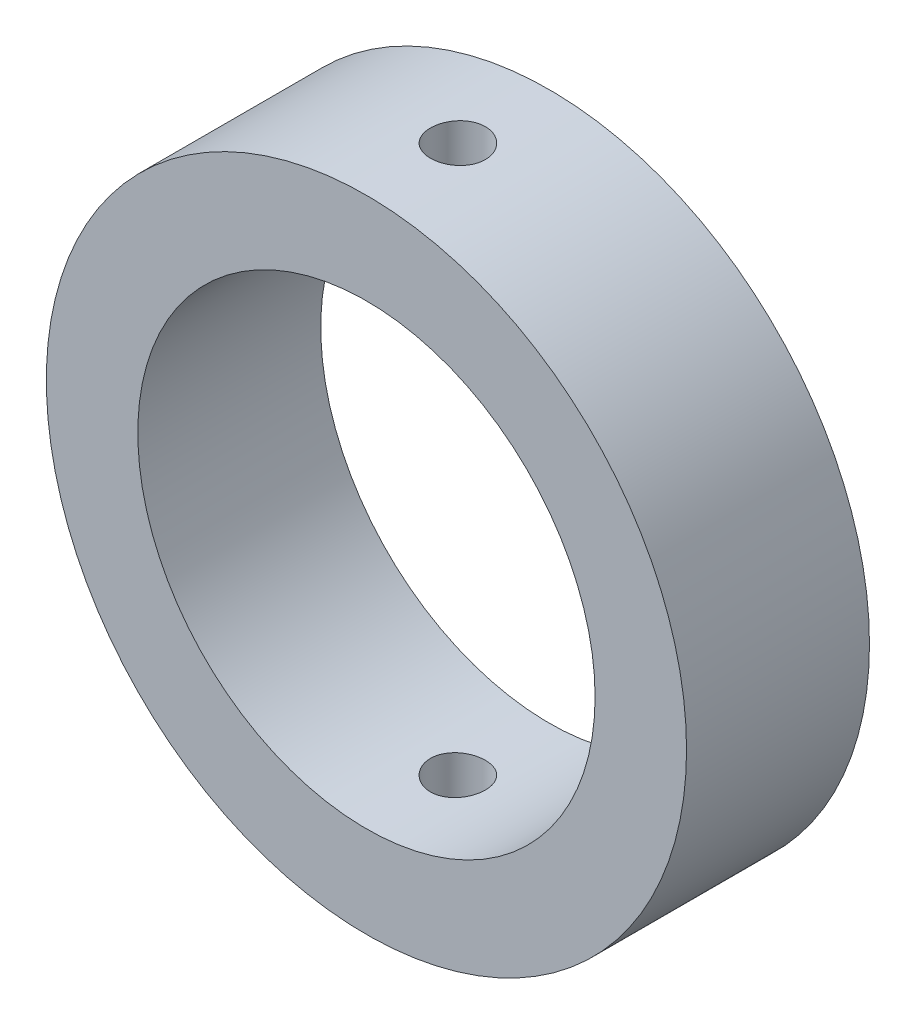
ISO-10303-21;
HEADER;
FILE_DESCRIPTION(('STEP AP214'),'2;1');
FILE_NAME('part.step','',(''),(''),'','','');
FILE_SCHEMA(('AUTOMOTIVE_DESIGN { 1 0 10303 214 1 1 1 1 }'));
ENDSEC;
DATA;
#1=APPLICATION_CONTEXT('core data for automotive mechanical design processes');
#2=APPLICATION_PROTOCOL_DEFINITION('international standard','automotive_design',2000,#1);
#3=PRODUCT_CONTEXT('',#1,'mechanical');
#4=PRODUCT('Part','Part','',(#3));
#5=PRODUCT_RELATED_PRODUCT_CATEGORY('part','',(#4));
#6=PRODUCT_DEFINITION_FORMATION('','',#4);
#7=PRODUCT_DEFINITION_CONTEXT('part definition',#1,'design');
#8=PRODUCT_DEFINITION('design','',#6,#7);
#9=PRODUCT_DEFINITION_SHAPE('','',#8);
#10=(LENGTH_UNIT() NAMED_UNIT(*) SI_UNIT(.MILLI.,.METRE.));
#11=(NAMED_UNIT(*) PLANE_ANGLE_UNIT() SI_UNIT($,.RADIAN.));
#12=(NAMED_UNIT(*) SI_UNIT($,.STERADIAN.) SOLID_ANGLE_UNIT());
#13=UNCERTAINTY_MEASURE_WITH_UNIT(LENGTH_MEASURE(1.E-05),#10,'distance_accuracy_value','');
#14=(GEOMETRIC_REPRESENTATION_CONTEXT(3) GLOBAL_UNCERTAINTY_ASSIGNED_CONTEXT((#13)) GLOBAL_UNIT_ASSIGNED_CONTEXT((#10,
#11,#12)) REPRESENTATION_CONTEXT('',''));
#15=CARTESIAN_POINT('',(0.,0.,0.));
#16=DIRECTION('',(0.,0.,1.));
#17=DIRECTION('',(1.,0.,0.));
#18=AXIS2_PLACEMENT_3D('',#15,#16,#17);
#19=CARTESIAN_POINT('',(0.,0.,20.));
#20=DIRECTION('',(0.,0.,1.));
#21=DIRECTION('',(1.,0.,0.));
#22=AXIS2_PLACEMENT_3D('',#19,#20,#21);
#23=PLANE('',#22);
#24=CARTESIAN_POINT('',(0.,0.,20.));
#25=DIRECTION('',(0.,0.,1.));
#26=DIRECTION('',(1.,0.,0.));
#27=AXIS2_PLACEMENT_3D('',#24,#25,#26);
#28=CIRCLE('',#27,35.);
#29=CARTESIAN_POINT('',(35.,0.,20.));
#30=VERTEX_POINT('',#29);
#31=EDGE_CURVE('E10',#30,#30,#28,.T.);
#32=ORIENTED_EDGE('',*,*,#31,.T.);
#33=EDGE_LOOP('',(#32));
#34=FACE_BOUND('',#33,.T.);
#35=CARTESIAN_POINT('',(0.,0.,20.));
#36=DIRECTION('',(0.,0.,1.));
#37=DIRECTION('',(1.,0.,0.));
#38=AXIS2_PLACEMENT_3D('',#35,#36,#37);
#39=CIRCLE('',#38,25.);
#40=CARTESIAN_POINT('',(25.,0.,20.));
#41=VERTEX_POINT('',#40);
#42=EDGE_CURVE('E58',#41,#41,#39,.T.);
#43=ORIENTED_EDGE('',*,*,#42,.F.);
#44=EDGE_LOOP('',(#43));
#45=FACE_BOUND('',#44,.T.);
#46=ADVANCED_FACE('F37',(#34,#45),#23,.T.);
#47=CARTESIAN_POINT('',(0.,0.,0.));
#48=DIRECTION('',(0.,0.,1.));
#49=DIRECTION('',(1.,0.,0.));
#50=AXIS2_PLACEMENT_3D('',#47,#48,#49);
#51=PLANE('',#50);
#52=CARTESIAN_POINT('',(0.,0.,0.));
#53=DIRECTION('',(0.,0.,1.));
#54=DIRECTION('',(1.,0.,0.));
#55=AXIS2_PLACEMENT_3D('',#52,#53,#54);
#56=CIRCLE('',#55,35.);
#57=CARTESIAN_POINT('',(35.,0.,0.));
#58=VERTEX_POINT('',#57);
#59=EDGE_CURVE('E52',#58,#58,#56,.T.);
#60=ORIENTED_EDGE('',*,*,#59,.F.);
#61=EDGE_LOOP('',(#60));
#62=FACE_BOUND('',#61,.T.);
#63=CARTESIAN_POINT('',(0.,0.,0.));
#64=DIRECTION('',(0.,0.,1.));
#65=DIRECTION('',(1.,0.,0.));
#66=AXIS2_PLACEMENT_3D('',#63,#64,#65);
#67=CIRCLE('',#66,25.);
#68=CARTESIAN_POINT('',(25.,0.,0.));
#69=VERTEX_POINT('',#68);
#70=EDGE_CURVE('E61',#69,#69,#67,.T.);
#71=ORIENTED_EDGE('',*,*,#70,.T.);
#72=EDGE_LOOP('',(#71));
#73=FACE_BOUND('',#72,.T.);
#74=ADVANCED_FACE('F102',(#62,#73),#51,.F.);
#75=CARTESIAN_POINT('',(0.,0.,20.));
#76=DIRECTION('',(0.,0.,-1.));
#77=DIRECTION('',(-1.,0.,0.));
#78=AXIS2_PLACEMENT_3D('',#75,#76,#77);
#79=CYLINDRICAL_SURFACE('',#78,35.);
#80=CARTESIAN_POINT('',(0.,-35.,13.));
#81=CARTESIAN_POINT('',(0.168180177421425,-34.9999983189466,12.9999926621086));
#82=CARTESIAN_POINT('',(0.336474410694065,-34.9987748870089,12.9858101377132));
#83=CARTESIAN_POINT('',(0.668405276387218,-34.9940120055983,12.9294427662291));
#84=CARTESIAN_POINT('',(0.832036433522409,-34.9904699418268,12.8872263096079));
#85=CARTESIAN_POINT('',(1.14978580604665,-34.9814700099417,12.7760219308489));
#86=CARTESIAN_POINT('',(1.30390939390644,-34.9760132356579,12.7070492915307));
#87=CARTESIAN_POINT('',(1.5983553572425,-34.9637955952331,12.5443180840418));
#88=CARTESIAN_POINT('',(1.7386806487592,-34.9570350055299,12.4505647683675));
#89=CARTESIAN_POINT('',(2.00196024172095,-34.9429478698077,12.2406617110507));
#90=CARTESIAN_POINT('',(2.12487233650439,-34.9356200130701,12.1244591132005));
#91=CARTESIAN_POINT('',(2.34947428548936,-34.9212352148941,11.8730679106441));
#92=CARTESIAN_POINT('',(2.45116320107853,-34.9141782854488,11.7378784666713));
#93=CARTESIAN_POINT('',(2.63057608789142,-34.9011203668809,11.4520942390574));
#94=CARTESIAN_POINT('',(2.70826279885841,-34.895121025662,11.3014759820008));
#95=CARTESIAN_POINT('',(2.83722803822898,-34.8848727505605,10.9892731041776));
#96=CARTESIAN_POINT('',(2.88850705745045,-34.8806237841455,10.8276886872931));
#97=CARTESIAN_POINT('',(2.96307845769353,-34.8743684880487,10.4985643557107));
#98=CARTESIAN_POINT('',(2.98643979537529,-34.8723566335604,10.3310401716124));
#99=CARTESIAN_POINT('',(3.00472573441206,-34.8707859372111,9.99443731566983));
#100=CARTESIAN_POINT('',(2.99965089755265,-34.8712270468893,9.82535867460139));
#101=CARTESIAN_POINT('',(2.96126551313284,-34.874507414771,9.49091935009246));
#102=CARTESIAN_POINT('',(2.92802995365881,-34.8773403039272,9.32554998866099));
#103=CARTESIAN_POINT('',(2.83438308452453,-34.8850750500347,9.00274549875546));
#104=CARTESIAN_POINT('',(2.77397149596722,-34.8899769282191,8.84531045172664));
#105=CARTESIAN_POINT('',(2.62760362876988,-34.9013046627491,8.5426048976093));
#106=CARTESIAN_POINT('',(2.54161375570937,-34.9077325210554,8.39735071245931));
#107=CARTESIAN_POINT('',(2.34655446417304,-34.9213861292491,8.12330862382476));
#108=CARTESIAN_POINT('',(2.23748455081154,-34.9286118962437,7.99452107351525));
#109=CARTESIAN_POINT('',(1.99894091774494,-34.9430754969892,7.75663207823613));
#110=CARTESIAN_POINT('',(1.86940237855328,-34.9503132942366,7.64759561833133));
#111=CARTESIAN_POINT('',(1.59382461581758,-34.9639632077666,7.45280656292255));
#112=CARTESIAN_POINT('',(1.44778538038973,-34.9703753234546,7.36705398418779));
#113=CARTESIAN_POINT('',(1.14330913680171,-34.9816527329005,7.2212707481009));
#114=CARTESIAN_POINT('',(0.984870717201058,-34.9865178502383,7.16124302414623));
#115=CARTESIAN_POINT('',(0.66011322112835,-34.9941511080319,7.06865924334512));
#116=CARTESIAN_POINT('',(0.493794317781497,-34.9969192945321,7.03610258328611));
#117=CARTESIAN_POINT('',(0.15856025083397,-35.0000408811527,6.99946669791016));
#118=CARTESIAN_POINT('',(-0.0103450366761302,-35.0004018916599,6.99529772286168));
#119=CARTESIAN_POINT('',(-0.346452104482659,-34.9986887867208,7.01532035576532));
#120=CARTESIAN_POINT('',(-0.513653901587615,-34.9966146953254,7.03951168360929));
#121=CARTESIAN_POINT('',(-0.841351421558966,-34.9902695086844,7.11549382233641));
#122=CARTESIAN_POINT('',(-1.00185687270474,-34.9860017297263,7.16724297716301));
#123=CARTESIAN_POINT('',(-1.31190702245475,-34.9757485102754,7.29682922006561));
#124=CARTESIAN_POINT('',(-1.46145153801856,-34.9697630411066,7.37466674367936));
#125=CARTESIAN_POINT('',(-1.7457428816744,-34.9567262474856,7.55444535294469));
#126=CARTESIAN_POINT('',(-1.88045202960912,-34.9496723123826,7.65644583152676));
#127=CARTESIAN_POINT('',(-2.13086824169311,-34.9352996751561,7.88156921992449));
#128=CARTESIAN_POINT('',(-2.24657495644839,-34.9279809681673,8.00469251803617));
#129=CARTESIAN_POINT('',(-2.45601016602155,-34.9138810732733,8.26895626973909));
#130=CARTESIAN_POINT('',(-2.54968004901865,-34.9071013498897,8.41014326356234));
#131=CARTESIAN_POINT('',(-2.71198063229128,-34.8948680127784,8.70629524502194));
#132=CARTESIAN_POINT('',(-2.78061159495576,-34.8894143851545,8.8612600882557));
#133=CARTESIAN_POINT('',(-2.8907865424564,-34.8804590783594,9.180362211124));
#134=CARTESIAN_POINT('',(-2.93236627395852,-34.8769548240937,9.34448707344406));
#135=CARTESIAN_POINT('',(-2.98737479633476,-34.872286503041,9.67742005737787));
#136=CARTESIAN_POINT('',(-3.0008041627162,-34.871122388412,9.84622808317732));
#137=CARTESIAN_POINT('',(-2.99912392353084,-34.8712668950776,10.1831530647903));
#138=CARTESIAN_POINT('',(-2.98410640669543,-34.8725675374248,10.3512704909289));
#139=CARTESIAN_POINT('',(-2.92615085557176,-34.8774780477604,10.6825859274482));
#140=CARTESIAN_POINT('',(-2.88321277999482,-34.8810879191635,10.8457839305537));
#141=CARTESIAN_POINT('',(-2.7706585792072,-34.8902080316544,11.1626330215739));
#142=CARTESIAN_POINT('',(-2.70104425727074,-34.8957181442861,11.3162847539864));
#143=CARTESIAN_POINT('',(-2.53712384137618,-34.9080181097009,11.6097355757974));
#144=CARTESIAN_POINT('',(-2.4428181018962,-34.9148079441114,11.7495348640265));
#145=CARTESIAN_POINT('',(-2.23184571903132,-34.9289284828144,12.0117838459397));
#146=CARTESIAN_POINT('',(-2.11511080731054,-34.9362607952504,12.1341785330169));
#147=CARTESIAN_POINT('',(-1.86271960746937,-34.9506254222313,12.357688026767));
#148=CARTESIAN_POINT('',(-1.72705875414518,-34.9576576638589,12.4587976843829));
#149=CARTESIAN_POINT('',(-1.44039065385252,-34.9706432183248,12.6370108284413));
#150=CARTESIAN_POINT('',(-1.28935405311577,-34.9765944046818,12.7140672103455));
#151=CARTESIAN_POINT('',(-0.976537475486436,-34.9867226680456,12.8416267776672));
#152=CARTESIAN_POINT('',(-0.814770058056751,-34.9909017781752,12.8921604088507));
#153=CARTESIAN_POINT('',(-0.543377751492647,-34.9959451685553,12.9524054943071));
#154=CARTESIAN_POINT('',(-0.4354969109927,-34.9974587860022,12.9702296244532));
#155=CARTESIAN_POINT('',(-0.218426750644092,-34.999486746251,12.9940292435666));
#156=CARTESIAN_POINT('',(-0.109237434508938,-35.0000010918883,13.0000047661528));
#157=CARTESIAN_POINT('',(0.,-35.,13.));
#158=B_SPLINE_CURVE_WITH_KNOTS('',3,(#80,#81,#82,#83,#84,#85,#86,#87,#88,#89,#90,#91,#92,#93,
#94,#95,#96,#97,#98,#99,#100,#101,#102,#103,#104,#105,#106,#107,#108,#109,#110,#111,#112,#113,
#114,#115,#116,#117,#118,#119,#120,#121,#122,#123,#124,#125,#126,#127,#128,#129,#130,#131,#132,
#133,#134,#135,#136,#137,#138,#139,#140,#141,#142,#143,#144,#145,#146,#147,#148,#149,#150,#151,
#152,#153,#154,#155,#156,#157),.UNSPECIFIED.,.T.,.F.,(4,2,2,2,2,2,2,2,2,2,2,2,2,2,2,2,2,2,2,2,2,
2,2,2,2,2,2,2,2,2,2,2,2,2,2,2,2,2,4),(0.,0.504141688620747,1.00885278730409,1.51327602436422,
2.01759242981481,2.5231110330061,3.0286519884333,3.53497383147415,4.04128626359052,
4.54634550220951,5.05139476290399,5.55510335902216,6.05881712462464,6.56319540924795,
7.06758450992202,7.57360414720597,8.07962414892789,8.58570183661505,9.09176841150507,
9.59623427417642,10.1006951543972,10.6043956535469,11.1081045622491,11.6130646830275,
12.1180340873686,12.6243317573245,13.1306241215114,13.636246082805,14.1418577070399,
14.6458353534655,15.1498137451707,15.6537580747011,16.1576951698375,16.6631911333163,
17.1688092410494,17.6754113983993,18.1814307424438,18.5088849156758,18.8363381597995),.UNSPECIFIED.);
#159=CARTESIAN_POINT('',(0.,-35.,13.));
#160=VERTEX_POINT('',#159);
#161=EDGE_CURVE('E88',#160,#160,#158,.T.);
#162=ORIENTED_EDGE('',*,*,#161,.T.);
#163=EDGE_LOOP('',(#162));
#164=FACE_BOUND('',#163,.T.);
#165=CARTESIAN_POINT('',(0.,35.,13.));
#166=CARTESIAN_POINT('',(-0.168180177421425,34.9999983189466,12.9999926621086));
#167=CARTESIAN_POINT('',(-0.336474410694065,34.9987748870089,12.9858101377132));
#168=CARTESIAN_POINT('',(-0.668405276387218,34.9940120055983,12.9294427662291));
#169=CARTESIAN_POINT('',(-0.832036433522409,34.9904699418268,12.8872263096079));
#170=CARTESIAN_POINT('',(-1.14978580604665,34.9814700099417,12.7760219308489));
#171=CARTESIAN_POINT('',(-1.30390939390644,34.9760132356579,12.7070492915307));
#172=CARTESIAN_POINT('',(-1.5983553572425,34.9637955952331,12.5443180840418));
#173=CARTESIAN_POINT('',(-1.7386806487592,34.9570350055299,12.4505647683675));
#174=CARTESIAN_POINT('',(-2.00196024172095,34.9429478698077,12.2406617110507));
#175=CARTESIAN_POINT('',(-2.12487233650439,34.9356200130701,12.1244591132005));
#176=CARTESIAN_POINT('',(-2.34947428548936,34.9212352148941,11.8730679106441));
#177=CARTESIAN_POINT('',(-2.45116320107853,34.9141782854488,11.7378784666713));
#178=CARTESIAN_POINT('',(-2.63057608789142,34.9011203668809,11.4520942390574));
#179=CARTESIAN_POINT('',(-2.70826279885841,34.895121025662,11.3014759820008));
#180=CARTESIAN_POINT('',(-2.83722803822898,34.8848727505605,10.9892731041776));
#181=CARTESIAN_POINT('',(-2.88850705745045,34.8806237841455,10.8276886872931));
#182=CARTESIAN_POINT('',(-2.96307845769353,34.8743684880487,10.4985643557107));
#183=CARTESIAN_POINT('',(-2.98643979537529,34.8723566335604,10.3310401716124));
#184=CARTESIAN_POINT('',(-3.00472573441206,34.8707859372111,9.99443731566983));
#185=CARTESIAN_POINT('',(-2.99965089755265,34.8712270468893,9.82535867460139));
#186=CARTESIAN_POINT('',(-2.96126551313284,34.874507414771,9.49091935009246));
#187=CARTESIAN_POINT('',(-2.92802995365881,34.8773403039272,9.32554998866099));
#188=CARTESIAN_POINT('',(-2.83438308452453,34.8850750500347,9.00274549875546));
#189=CARTESIAN_POINT('',(-2.77397149596722,34.8899769282191,8.84531045172664));
#190=CARTESIAN_POINT('',(-2.62760362876988,34.9013046627491,8.5426048976093));
#191=CARTESIAN_POINT('',(-2.54161375570937,34.9077325210554,8.39735071245931));
#192=CARTESIAN_POINT('',(-2.34655446417304,34.9213861292491,8.12330862382476));
#193=CARTESIAN_POINT('',(-2.23748455081154,34.9286118962437,7.99452107351525));
#194=CARTESIAN_POINT('',(-1.99894091774494,34.9430754969892,7.75663207823613));
#195=CARTESIAN_POINT('',(-1.86940237855328,34.9503132942366,7.64759561833133));
#196=CARTESIAN_POINT('',(-1.59382461581758,34.9639632077666,7.45280656292255));
#197=CARTESIAN_POINT('',(-1.44778538038973,34.9703753234546,7.36705398418779));
#198=CARTESIAN_POINT('',(-1.14330913680171,34.9816527329005,7.2212707481009));
#199=CARTESIAN_POINT('',(-0.984870717201058,34.9865178502383,7.16124302414623));
#200=CARTESIAN_POINT('',(-0.66011322112835,34.9941511080319,7.06865924334512));
#201=CARTESIAN_POINT('',(-0.493794317781497,34.9969192945321,7.03610258328611));
#202=CARTESIAN_POINT('',(-0.15856025083397,35.0000408811527,6.99946669791016));
#203=CARTESIAN_POINT('',(0.0103450366761302,35.0004018916599,6.99529772286168));
#204=CARTESIAN_POINT('',(0.346452104482659,34.9986887867208,7.01532035576532));
#205=CARTESIAN_POINT('',(0.513653901587615,34.9966146953254,7.03951168360929));
#206=CARTESIAN_POINT('',(0.841351421558966,34.9902695086844,7.11549382233641));
#207=CARTESIAN_POINT('',(1.00185687270474,34.9860017297263,7.16724297716301));
#208=CARTESIAN_POINT('',(1.31190702245475,34.9757485102754,7.29682922006561));
#209=CARTESIAN_POINT('',(1.46145153801856,34.9697630411066,7.37466674367936));
#210=CARTESIAN_POINT('',(1.7457428816744,34.9567262474856,7.55444535294469));
#211=CARTESIAN_POINT('',(1.88045202960912,34.9496723123826,7.65644583152676));
#212=CARTESIAN_POINT('',(2.13086824169311,34.9352996751561,7.88156921992449));
#213=CARTESIAN_POINT('',(2.24657495644839,34.9279809681673,8.00469251803617));
#214=CARTESIAN_POINT('',(2.45601016602155,34.9138810732733,8.26895626973909));
#215=CARTESIAN_POINT('',(2.54968004901865,34.9071013498897,8.41014326356234));
#216=CARTESIAN_POINT('',(2.71198063229128,34.8948680127784,8.70629524502194));
#217=CARTESIAN_POINT('',(2.78061159495576,34.8894143851545,8.8612600882557));
#218=CARTESIAN_POINT('',(2.8907865424564,34.8804590783594,9.180362211124));
#219=CARTESIAN_POINT('',(2.93236627395852,34.8769548240937,9.34448707344406));
#220=CARTESIAN_POINT('',(2.98737479633476,34.872286503041,9.67742005737787));
#221=CARTESIAN_POINT('',(3.0008041627162,34.871122388412,9.84622808317732));
#222=CARTESIAN_POINT('',(2.99912392353084,34.8712668950776,10.1831530647903));
#223=CARTESIAN_POINT('',(2.98410640669543,34.8725675374248,10.3512704909289));
#224=CARTESIAN_POINT('',(2.92615085557176,34.8774780477604,10.6825859274482));
#225=CARTESIAN_POINT('',(2.88321277999482,34.8810879191635,10.8457839305537));
#226=CARTESIAN_POINT('',(2.7706585792072,34.8902080316544,11.1626330215739));
#227=CARTESIAN_POINT('',(2.70104425727074,34.8957181442861,11.3162847539864));
#228=CARTESIAN_POINT('',(2.53712384137618,34.9080181097009,11.6097355757974));
#229=CARTESIAN_POINT('',(2.4428181018962,34.9148079441114,11.7495348640265));
#230=CARTESIAN_POINT('',(2.23184571903132,34.9289284828144,12.0117838459397));
#231=CARTESIAN_POINT('',(2.11511080731054,34.9362607952504,12.1341785330169));
#232=CARTESIAN_POINT('',(1.86271960746937,34.9506254222313,12.357688026767));
#233=CARTESIAN_POINT('',(1.72705875414518,34.9576576638589,12.4587976843829));
#234=CARTESIAN_POINT('',(1.44039065385252,34.9706432183248,12.6370108284413));
#235=CARTESIAN_POINT('',(1.28935405311577,34.9765944046818,12.7140672103455));
#236=CARTESIAN_POINT('',(0.976537475486436,34.9867226680456,12.8416267776672));
#237=CARTESIAN_POINT('',(0.814770058056751,34.9909017781752,12.8921604088507));
#238=CARTESIAN_POINT('',(0.543377751492647,34.9959451685553,12.9524054943071));
#239=CARTESIAN_POINT('',(0.4354969109927,34.9974587860022,12.9702296244532));
#240=CARTESIAN_POINT('',(0.218426750644092,34.999486746251,12.9940292435666));
#241=CARTESIAN_POINT('',(0.109237434508938,35.0000010918883,13.0000047661528));
#242=CARTESIAN_POINT('',(0.,35.,13.));
#243=B_SPLINE_CURVE_WITH_KNOTS('',3,(#165,#166,#167,#168,#169,#170,#171,#172,#173,#174,#175,
#176,#177,#178,#179,#180,#181,#182,#183,#184,#185,#186,#187,#188,#189,#190,#191,#192,#193,#194,
#195,#196,#197,#198,#199,#200,#201,#202,#203,#204,#205,#206,#207,#208,#209,#210,#211,#212,#213,
#214,#215,#216,#217,#218,#219,#220,#221,#222,#223,#224,#225,#226,#227,#228,#229,#230,#231,#232,
#233,#234,#235,#236,#237,#238,#239,#240,#241,#242),.UNSPECIFIED.,.T.,.F.,(4,2,2,2,2,2,2,2,2,2,2,
2,2,2,2,2,2,2,2,2,2,2,2,2,2,2,2,2,2,2,2,2,2,2,2,2,2,2,4),(0.,0.504141688620747,1.00885278730409,
1.51327602436422,2.01759242981481,2.5231110330061,3.0286519884333,3.53497383147415,
4.04128626359052,4.54634550220951,5.05139476290399,5.55510335902216,6.05881712462464,
6.56319540924795,7.06758450992202,7.57360414720597,8.07962414892789,8.58570183661505,
9.09176841150507,9.59623427417642,10.1006951543972,10.6043956535469,11.1081045622491,
11.6130646830275,12.1180340873686,12.6243317573245,13.1306241215114,13.636246082805,
14.1418577070399,14.6458353534655,15.1498137451707,15.6537580747011,16.1576951698375,
16.6631911333163,17.1688092410494,17.6754113983993,18.1814307424438,18.5088849156758,
18.8363381597995),.UNSPECIFIED.);
#244=CARTESIAN_POINT('',(0.,35.,13.));
#245=VERTEX_POINT('',#244);
#246=EDGE_CURVE('E82',#245,#245,#243,.T.);
#247=ORIENTED_EDGE('',*,*,#246,.T.);
#248=EDGE_LOOP('',(#247));
#249=FACE_BOUND('',#248,.T.);
#250=ORIENTED_EDGE('',*,*,#31,.F.);
#251=EDGE_LOOP('',(#250));
#252=FACE_BOUND('',#251,.T.);
#253=ORIENTED_EDGE('',*,*,#59,.T.);
#254=EDGE_LOOP('',(#253));
#255=FACE_BOUND('',#254,.T.);
#256=ADVANCED_FACE('F39',(#164,#249,#252,#255),#79,.T.);
#257=CARTESIAN_POINT('',(0.,0.,20.));
#258=DIRECTION('',(0.,0.,-1.));
#259=DIRECTION('',(-1.,0.,0.));
#260=AXIS2_PLACEMENT_3D('',#257,#258,#259);
#261=CYLINDRICAL_SURFACE('',#260,25.);
#262=CARTESIAN_POINT('',(0.,-25.,13.));
#263=CARTESIAN_POINT('',(0.167864047107699,-24.9999977357459,12.9999928360586));
#264=CARTESIAN_POINT('',(0.335834317331191,-24.9982914200408,12.9858633413073));
#265=CARTESIAN_POINT('',(0.66710457130825,-24.991648705422,12.9297189358446));
#266=CARTESIAN_POINT('',(0.830399429590069,-24.9867088933728,12.8876745587494));
#267=CARTESIAN_POINT('',(1.14747479534053,-24.9741559265426,12.776953723474));
#268=CARTESIAN_POINT('',(1.30126148759225,-24.9665445315309,12.7082947931758));
#269=CARTESIAN_POINT('',(1.595099157832,-24.9494959264345,12.5463312649167));
#270=CARTESIAN_POINT('',(1.73515256713516,-24.9400590404141,12.4530310402467));
#271=CARTESIAN_POINT('',(1.99829131534451,-24.920360105442,12.2439251380248));
#272=CARTESIAN_POINT('',(2.1212966913072,-24.9100945030904,12.1280191598881));
#273=CARTESIAN_POINT('',(2.34615931038342,-24.8899239397152,11.8772070351121));
#274=CARTESIAN_POINT('',(2.44801549826474,-24.8800189967068,11.7422999409814));
#275=CARTESIAN_POINT('',(2.62798342873896,-24.8616560370405,11.4567991747016));
#276=CARTESIAN_POINT('',(2.7060207567257,-24.8532025903971,11.3061582754199));
#277=CARTESIAN_POINT('',(2.8356605730156,-24.8387461344686,10.9937912978913));
#278=CARTESIAN_POINT('',(2.88726398696776,-24.8327430393798,10.8320656080307));
#279=CARTESIAN_POINT('',(2.96232930045399,-24.8239006073737,10.5029471406886));
#280=CARTESIAN_POINT('',(2.98592577987646,-24.8210461452543,10.3355854715723));
#281=CARTESIAN_POINT('',(3.0047237521967,-24.8187777690611,9.99925506363583));
#282=CARTESIAN_POINT('',(2.99992630052848,-24.8193637271033,9.83028638478303));
#283=CARTESIAN_POINT('',(2.96218316078668,-24.8238961466306,9.49647403521565));
#284=CARTESIAN_POINT('',(2.92938543222303,-24.8278249434675,9.33161336131982));
#285=CARTESIAN_POINT('',(2.83680346170067,-24.8385728087608,9.00975297217864));
#286=CARTESIAN_POINT('',(2.77701871225814,-24.8453919315688,8.85275340482101));
#287=CARTESIAN_POINT('',(2.63199980699862,-24.8611722079476,8.55061053176089));
#288=CARTESIAN_POINT('',(2.54670106203925,-24.8701387862198,8.40549852164644));
#289=CARTESIAN_POINT('',(2.35312173169469,-24.8891993987901,8.13159278908424));
#290=CARTESIAN_POINT('',(2.24484017723157,-24.8992934806213,8.00279975509743));
#291=CARTESIAN_POINT('',(2.0075475556218,-24.9195503308637,7.76432891563562));
#292=CARTESIAN_POINT('',(1.87840890051216,-24.929713127424,7.65477803014294));
#293=CARTESIAN_POINT('',(1.60350795893872,-24.9489020798549,7.45888847899969));
#294=CARTESIAN_POINT('',(1.45774563908005,-24.9579282334421,7.37254985998085));
#295=CARTESIAN_POINT('',(1.15363930826285,-24.9738318861702,7.22553671436034));
#296=CARTESIAN_POINT('',(0.995291578715591,-24.9807087472809,7.16486980666956));
#297=CARTESIAN_POINT('',(0.67055602227344,-24.991533065309,7.0710212621491));
#298=CARTESIAN_POINT('',(0.504168542441623,-24.9954806485584,7.03783843999552));
#299=CARTESIAN_POINT('',(0.169174396374217,-24.9999852500304,7.00006374450231));
#300=CARTESIAN_POINT('',(0.000587720432051526,-25.0005630093753,6.9952969675993));
#301=CARTESIAN_POINT('',(-0.33498206824326,-24.9983187823231,7.01402857786827));
#302=CARTESIAN_POINT('',(-0.501965212327328,-24.9954968625308,7.03752641129535));
#303=CARTESIAN_POINT('',(-0.829074263928356,-24.9867833380686,7.11197496400309));
#304=CARTESIAN_POINT('',(-0.989219346369035,-24.9809010237909,7.16284261305008));
#305=CARTESIAN_POINT('',(-1.29870539768646,-24.9667255501792,7.29050070335358));
#306=CARTESIAN_POINT('',(-1.44804602592347,-24.9584323148759,7.36729196149009));
#307=CARTESIAN_POINT('',(-1.73246717766504,-24.9403085158695,7.54504291590243));
#308=CARTESIAN_POINT('',(-1.86747628962751,-24.9304708084643,7.64611613781082));
#309=CARTESIAN_POINT('',(-2.11867625152203,-24.9103817919419,7.86940084640817));
#310=CARTESIAN_POINT('',(-2.23486641472949,-24.9001304677484,7.99161310414795));
#311=CARTESIAN_POINT('',(-2.44574795226154,-24.8803059484942,8.25447561542769));
#312=CARTESIAN_POINT('',(-2.54032363231939,-24.8707365831307,8.39521901534385));
#313=CARTESIAN_POINT('',(-2.70449314429332,-24.8534214993383,8.69069502507556));
#314=CARTESIAN_POINT('',(-2.77408744356074,-24.8456757467943,8.84542737311824));
#315=CARTESIAN_POINT('',(-2.88612996668159,-24.8329105734502,9.1641106088947));
#316=CARTESIAN_POINT('',(-2.92864420159346,-24.8278845275633,9.32803801185939));
#317=CARTESIAN_POINT('',(-2.98553272163516,-24.8211085274587,9.66076896948507));
#318=CARTESIAN_POINT('',(-2.99990820526081,-24.8193584337106,9.82957231615732));
#319=CARTESIAN_POINT('',(-3.00009033817931,-24.819336326607,10.1661127296372));
#320=CARTESIAN_POINT('',(-2.98607873671351,-24.8210421863943,10.3338497257713));
#321=CARTESIAN_POINT('',(-2.93026848672089,-24.8276922947425,10.6645667863942));
#322=CARTESIAN_POINT('',(-2.88846982822067,-24.8326365444656,10.8275468491756));
#323=CARTESIAN_POINT('',(-2.77832739820545,-24.8451996524586,11.1441045388887));
#324=CARTESIAN_POINT('',(-2.70999165570539,-24.8528177016812,11.2976849934955));
#325=CARTESIAN_POINT('',(-2.5487328262801,-24.8698714539139,11.5912277470701));
#326=CARTESIAN_POINT('',(-2.45580952709445,-24.8793071726153,11.7311899284593));
#327=CARTESIAN_POINT('',(-2.24733689647205,-24.8990055122588,11.9944529401088));
#328=CARTESIAN_POINT('',(-2.1316520393015,-24.9092728581347,12.1176461032663));
#329=CARTESIAN_POINT('',(-1.88122093334447,-24.9294354968169,12.342942479566));
#330=CARTESIAN_POINT('',(-1.74647018263601,-24.939330701051,12.4450406976292));
#331=CARTESIAN_POINT('',(-1.46119322465137,-24.9576721709324,12.6255505779989));
#332=CARTESIAN_POINT('',(-1.31061323462417,-24.966113221621,12.7038777257223));
#333=CARTESIAN_POINT('',(-0.99842275168531,-24.9805418519727,12.8340237644426));
#334=CARTESIAN_POINT('',(-0.836824564362144,-24.9865321180615,12.8858716961804));
#335=CARTESIAN_POINT('',(-0.561977101236697,-24.9939268325999,12.9490634203381));
#336=CARTESIAN_POINT('',(-0.450466569753487,-24.996193279433,12.9681374838864));
#337=CARTESIAN_POINT('',(-0.225986735693694,-24.9992306204204,12.993608143491));
#338=CARTESIAN_POINT('',(-0.113017442753625,-25.0000015244492,13.0000048232505));
#339=CARTESIAN_POINT('',(0.,-25.,13.));
#340=B_SPLINE_CURVE_WITH_KNOTS('',3,(#262,#263,#264,#265,#266,#267,#268,#269,#270,#271,#272,
#273,#274,#275,#276,#277,#278,#279,#280,#281,#282,#283,#284,#285,#286,#287,#288,#289,#290,#291,
#292,#293,#294,#295,#296,#297,#298,#299,#300,#301,#302,#303,#304,#305,#306,#307,#308,#309,#310,
#311,#312,#313,#314,#315,#316,#317,#318,#319,#320,#321,#322,#323,#324,#325,#326,#327,#328,#329,
#330,#331,#332,#333,#334,#335,#336,#337,#338,#339),.UNSPECIFIED.,.T.,.F.,(4,2,2,2,2,2,2,2,2,2,2,
2,2,2,2,2,2,2,2,2,2,2,2,2,2,2,2,2,2,2,2,2,2,2,2,2,2,2,4),(0.,0.503179350956159,1.00689069408623,
1.5102708637556,2.01356175441693,2.51913872195878,3.02474090904883,3.53190689496397,
4.03905511999113,4.54375638343279,5.0484388866848,5.55047092912253,6.05251241253396,
6.55583573710536,7.05918028869262,7.56572944640317,8.07227962172601,8.57898002694278,
9.08565857822619,9.58921522624226,10.0927620090108,10.5947890255775,11.0968318630167,
11.6012692178556,12.1057249760356,12.6128207581672,13.119907053063,13.6257524826489,
14.1315763666154,14.6341719319229,15.1367676776234,15.6392114771388,16.1416596143122,
16.6471952402032,17.1528504352009,17.6602829023946,18.1671576479275,18.5059342945627,
18.8447087043981),.UNSPECIFIED.);
#341=CARTESIAN_POINT('',(0.,-25.,13.));
#342=VERTEX_POINT('',#341);
#343=EDGE_CURVE('E42',#342,#342,#340,.T.);
#344=ORIENTED_EDGE('',*,*,#343,.F.);
#345=EDGE_LOOP('',(#344));
#346=FACE_BOUND('',#345,.T.);
#347=CARTESIAN_POINT('',(0.,25.,13.));
#348=CARTESIAN_POINT('',(-0.167864047107699,24.9999977357459,12.9999928360586));
#349=CARTESIAN_POINT('',(-0.335834317331191,24.9982914200408,12.9858633413073));
#350=CARTESIAN_POINT('',(-0.66710457130825,24.991648705422,12.9297189358446));
#351=CARTESIAN_POINT('',(-0.830399429590069,24.9867088933728,12.8876745587494));
#352=CARTESIAN_POINT('',(-1.14747479534053,24.9741559265426,12.776953723474));
#353=CARTESIAN_POINT('',(-1.30126148759225,24.9665445315309,12.7082947931758));
#354=CARTESIAN_POINT('',(-1.595099157832,24.9494959264345,12.5463312649167));
#355=CARTESIAN_POINT('',(-1.73515256713516,24.9400590404141,12.4530310402467));
#356=CARTESIAN_POINT('',(-1.99829131534451,24.920360105442,12.2439251380248));
#357=CARTESIAN_POINT('',(-2.1212966913072,24.9100945030904,12.1280191598881));
#358=CARTESIAN_POINT('',(-2.34615931038342,24.8899239397152,11.8772070351121));
#359=CARTESIAN_POINT('',(-2.44801549826474,24.8800189967068,11.7422999409814));
#360=CARTESIAN_POINT('',(-2.62798342873896,24.8616560370405,11.4567991747016));
#361=CARTESIAN_POINT('',(-2.7060207567257,24.8532025903971,11.3061582754199));
#362=CARTESIAN_POINT('',(-2.8356605730156,24.8387461344686,10.9937912978913));
#363=CARTESIAN_POINT('',(-2.88726398696776,24.8327430393798,10.8320656080307));
#364=CARTESIAN_POINT('',(-2.96232930045399,24.8239006073737,10.5029471406886));
#365=CARTESIAN_POINT('',(-2.98592577987646,24.8210461452543,10.3355854715723));
#366=CARTESIAN_POINT('',(-3.0047237521967,24.8187777690611,9.99925506363583));
#367=CARTESIAN_POINT('',(-2.99992630052848,24.8193637271033,9.83028638478303));
#368=CARTESIAN_POINT('',(-2.96218316078668,24.8238961466306,9.49647403521565));
#369=CARTESIAN_POINT('',(-2.92938543222303,24.8278249434675,9.33161336131982));
#370=CARTESIAN_POINT('',(-2.83680346170067,24.8385728087608,9.00975297217864));
#371=CARTESIAN_POINT('',(-2.77701871225814,24.8453919315688,8.85275340482101));
#372=CARTESIAN_POINT('',(-2.63199980699862,24.8611722079476,8.55061053176089));
#373=CARTESIAN_POINT('',(-2.54670106203925,24.8701387862198,8.40549852164644));
#374=CARTESIAN_POINT('',(-2.35312173169469,24.8891993987901,8.13159278908424));
#375=CARTESIAN_POINT('',(-2.24484017723157,24.8992934806213,8.00279975509743));
#376=CARTESIAN_POINT('',(-2.0075475556218,24.9195503308637,7.76432891563562));
#377=CARTESIAN_POINT('',(-1.87840890051216,24.929713127424,7.65477803014294));
#378=CARTESIAN_POINT('',(-1.60350795893872,24.9489020798549,7.45888847899969));
#379=CARTESIAN_POINT('',(-1.45774563908005,24.9579282334421,7.37254985998085));
#380=CARTESIAN_POINT('',(-1.15363930826285,24.9738318861702,7.22553671436034));
#381=CARTESIAN_POINT('',(-0.995291578715591,24.9807087472809,7.16486980666956));
#382=CARTESIAN_POINT('',(-0.67055602227344,24.991533065309,7.0710212621491));
#383=CARTESIAN_POINT('',(-0.504168542441623,24.9954806485584,7.03783843999552));
#384=CARTESIAN_POINT('',(-0.169174396374217,24.9999852500304,7.00006374450231));
#385=CARTESIAN_POINT('',(-0.000587720432051526,25.0005630093753,6.9952969675993));
#386=CARTESIAN_POINT('',(0.33498206824326,24.9983187823231,7.01402857786827));
#387=CARTESIAN_POINT('',(0.501965212327328,24.9954968625308,7.03752641129535));
#388=CARTESIAN_POINT('',(0.829074263928356,24.9867833380686,7.11197496400309));
#389=CARTESIAN_POINT('',(0.989219346369035,24.9809010237909,7.16284261305008));
#390=CARTESIAN_POINT('',(1.29870539768646,24.9667255501792,7.29050070335358));
#391=CARTESIAN_POINT('',(1.44804602592347,24.9584323148759,7.36729196149009));
#392=CARTESIAN_POINT('',(1.73246717766504,24.9403085158695,7.54504291590243));
#393=CARTESIAN_POINT('',(1.86747628962751,24.9304708084643,7.64611613781082));
#394=CARTESIAN_POINT('',(2.11867625152203,24.9103817919419,7.86940084640817));
#395=CARTESIAN_POINT('',(2.23486641472949,24.9001304677484,7.99161310414795));
#396=CARTESIAN_POINT('',(2.44574795226154,24.8803059484942,8.25447561542769));
#397=CARTESIAN_POINT('',(2.54032363231939,24.8707365831307,8.39521901534385));
#398=CARTESIAN_POINT('',(2.70449314429332,24.8534214993383,8.69069502507556));
#399=CARTESIAN_POINT('',(2.77408744356074,24.8456757467943,8.84542737311824));
#400=CARTESIAN_POINT('',(2.88612996668159,24.8329105734502,9.1641106088947));
#401=CARTESIAN_POINT('',(2.92864420159346,24.8278845275633,9.32803801185939));
#402=CARTESIAN_POINT('',(2.98553272163516,24.8211085274587,9.66076896948507));
#403=CARTESIAN_POINT('',(2.99990820526081,24.8193584337106,9.82957231615732));
#404=CARTESIAN_POINT('',(3.00009033817931,24.819336326607,10.1661127296372));
#405=CARTESIAN_POINT('',(2.98607873671351,24.8210421863943,10.3338497257713));
#406=CARTESIAN_POINT('',(2.93026848672089,24.8276922947425,10.6645667863942));
#407=CARTESIAN_POINT('',(2.88846982822067,24.8326365444656,10.8275468491756));
#408=CARTESIAN_POINT('',(2.77832739820545,24.8451996524586,11.1441045388887));
#409=CARTESIAN_POINT('',(2.70999165570539,24.8528177016812,11.2976849934955));
#410=CARTESIAN_POINT('',(2.5487328262801,24.8698714539139,11.5912277470701));
#411=CARTESIAN_POINT('',(2.45580952709445,24.8793071726153,11.7311899284593));
#412=CARTESIAN_POINT('',(2.24733689647205,24.8990055122588,11.9944529401088));
#413=CARTESIAN_POINT('',(2.1316520393015,24.9092728581347,12.1176461032663));
#414=CARTESIAN_POINT('',(1.88122093334447,24.9294354968169,12.342942479566));
#415=CARTESIAN_POINT('',(1.74647018263601,24.939330701051,12.4450406976292));
#416=CARTESIAN_POINT('',(1.46119322465137,24.9576721709324,12.6255505779989));
#417=CARTESIAN_POINT('',(1.31061323462417,24.966113221621,12.7038777257223));
#418=CARTESIAN_POINT('',(0.99842275168531,24.9805418519727,12.8340237644426));
#419=CARTESIAN_POINT('',(0.836824564362144,24.9865321180615,12.8858716961804));
#420=CARTESIAN_POINT('',(0.561977101236697,24.9939268325999,12.9490634203381));
#421=CARTESIAN_POINT('',(0.450466569753487,24.996193279433,12.9681374838864));
#422=CARTESIAN_POINT('',(0.225986735693694,24.9992306204204,12.993608143491));
#423=CARTESIAN_POINT('',(0.113017442753625,25.0000015244492,13.0000048232505));
#424=CARTESIAN_POINT('',(0.,25.,13.));
#425=B_SPLINE_CURVE_WITH_KNOTS('',3,(#347,#348,#349,#350,#351,#352,#353,#354,#355,#356,#357,
#358,#359,#360,#361,#362,#363,#364,#365,#366,#367,#368,#369,#370,#371,#372,#373,#374,#375,#376,
#377,#378,#379,#380,#381,#382,#383,#384,#385,#386,#387,#388,#389,#390,#391,#392,#393,#394,#395,
#396,#397,#398,#399,#400,#401,#402,#403,#404,#405,#406,#407,#408,#409,#410,#411,#412,#413,#414,
#415,#416,#417,#418,#419,#420,#421,#422,#423,#424),.UNSPECIFIED.,.T.,.F.,(4,2,2,2,2,2,2,2,2,2,2,
2,2,2,2,2,2,2,2,2,2,2,2,2,2,2,2,2,2,2,2,2,2,2,2,2,2,2,4),(0.,0.503179350956159,1.00689069408623,
1.5102708637556,2.01356175441693,2.51913872195878,3.02474090904883,3.53190689496397,
4.03905511999113,4.54375638343279,5.0484388866848,5.55047092912253,6.05251241253396,
6.55583573710536,7.05918028869262,7.56572944640317,8.07227962172601,8.57898002694278,
9.08565857822619,9.58921522624226,10.0927620090108,10.5947890255775,11.0968318630167,
11.6012692178556,12.1057249760356,12.6128207581672,13.119907053063,13.6257524826489,
14.1315763666154,14.6341719319229,15.1367676776234,15.6392114771388,16.1416596143122,
16.6471952402032,17.1528504352009,17.6602829023946,18.1671576479275,18.5059342945627,
18.8447087043981),.UNSPECIFIED.);
#426=CARTESIAN_POINT('',(0.,25.,13.));
#427=VERTEX_POINT('',#426);
#428=EDGE_CURVE('E63',#427,#427,#425,.T.);
#429=ORIENTED_EDGE('',*,*,#428,.F.);
#430=EDGE_LOOP('',(#429));
#431=FACE_BOUND('',#430,.T.);
#432=ORIENTED_EDGE('',*,*,#42,.T.);
#433=EDGE_LOOP('',(#432));
#434=FACE_BOUND('',#433,.T.);
#435=ORIENTED_EDGE('',*,*,#70,.F.);
#436=EDGE_LOOP('',(#435));
#437=FACE_BOUND('',#436,.T.);
#438=ADVANCED_FACE('F69',(#346,#431,#434,#437),#261,.F.);
#439=CARTESIAN_POINT('',(0.,-35.,10.));
#440=DIRECTION('',(0.,1.,0.));
#441=DIRECTION('',(0.,0.,1.));
#442=AXIS2_PLACEMENT_3D('',#439,#440,#441);
#443=CYLINDRICAL_SURFACE('',#442,3.);
#444=ORIENTED_EDGE('',*,*,#428,.T.);
#445=EDGE_LOOP('',(#444));
#446=FACE_BOUND('',#445,.T.);
#447=ORIENTED_EDGE('',*,*,#246,.F.);
#448=EDGE_LOOP('',(#447));
#449=FACE_BOUND('',#448,.T.);
#450=ADVANCED_FACE('F75',(#446,#449),#443,.F.);
#451=ORIENTED_EDGE('',*,*,#343,.T.);
#452=EDGE_LOOP('',(#451));
#453=FACE_BOUND('',#452,.T.);
#454=ORIENTED_EDGE('',*,*,#161,.F.);
#455=EDGE_LOOP('',(#454));
#456=FACE_BOUND('',#455,.T.);
#457=ADVANCED_FACE('F72',(#453,#456),#443,.F.);
#458=CLOSED_SHELL('',(#46,#74,#256,#438,#450,#457));
#459=MANIFOLD_SOLID_BREP('B2',#458);
#460=ADVANCED_BREP_SHAPE_REPRESENTATION('',(#18,#459),#14);
#461=SHAPE_DEFINITION_REPRESENTATION(#9,#460);
ENDSEC;
END-ISO-10303-21;
